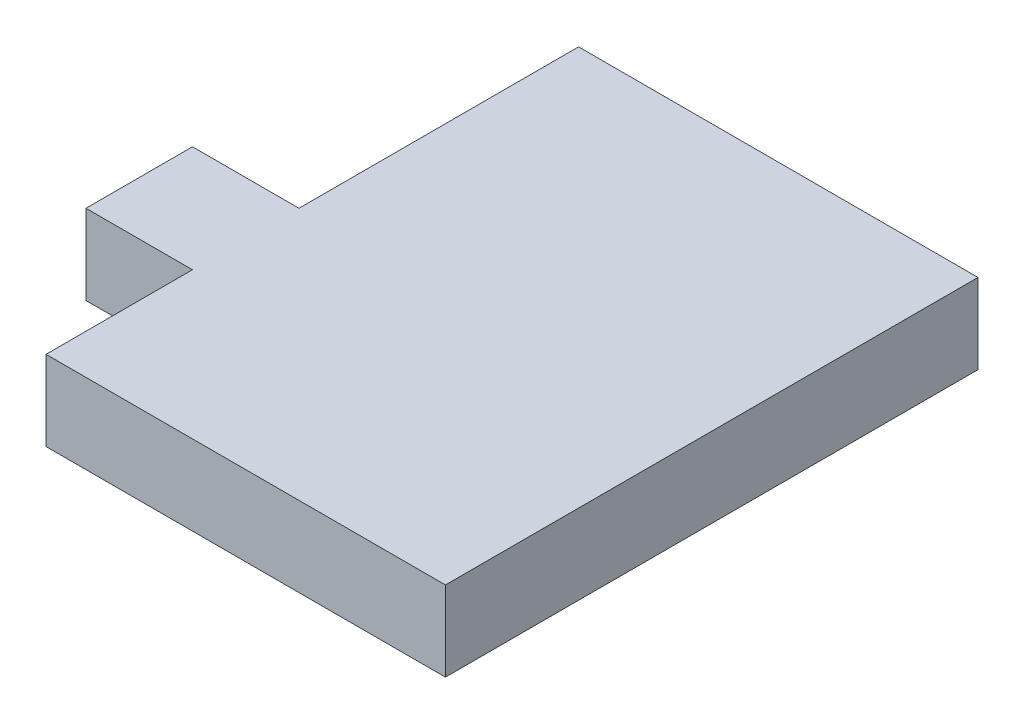
ISO-10303-21;
HEADER;
FILE_DESCRIPTION(('STEP AP214'),'2;1');
FILE_NAME('part.step','',(''),(''),'','','');
FILE_SCHEMA(('AUTOMOTIVE_DESIGN { 1 0 10303 214 1 1 1 1 }'));
ENDSEC;
DATA;
#1=APPLICATION_CONTEXT('core data for automotive mechanical design processes');
#2=APPLICATION_PROTOCOL_DEFINITION('international standard','automotive_design',2000,#1);
#3=PRODUCT_CONTEXT('',#1,'mechanical');
#4=PRODUCT('Part','Part','',(#3));
#5=PRODUCT_RELATED_PRODUCT_CATEGORY('part','',(#4));
#6=PRODUCT_DEFINITION_FORMATION('','',#4);
#7=PRODUCT_DEFINITION_CONTEXT('part definition',#1,'design');
#8=PRODUCT_DEFINITION('design','',#6,#7);
#9=PRODUCT_DEFINITION_SHAPE('','',#8);
#10=(LENGTH_UNIT() NAMED_UNIT(*) SI_UNIT(.MILLI.,.METRE.));
#11=(NAMED_UNIT(*) PLANE_ANGLE_UNIT() SI_UNIT($,.RADIAN.));
#12=(NAMED_UNIT(*) SI_UNIT($,.STERADIAN.) SOLID_ANGLE_UNIT());
#13=UNCERTAINTY_MEASURE_WITH_UNIT(LENGTH_MEASURE(1.E-05),#10,'distance_accuracy_value','');
#14=(GEOMETRIC_REPRESENTATION_CONTEXT(3) GLOBAL_UNCERTAINTY_ASSIGNED_CONTEXT((#13)) GLOBAL_UNIT_ASSIGNED_CONTEXT((#10,
#11,#12)) REPRESENTATION_CONTEXT('',''));
#15=CARTESIAN_POINT('',(0.,0.,0.));
#16=DIRECTION('',(0.,0.,1.));
#17=DIRECTION('',(1.,0.,0.));
#18=AXIS2_PLACEMENT_3D('',#15,#16,#17);
#19=CARTESIAN_POINT('',(0.,0.3,-2.));
#20=DIRECTION('',(-1.,0.,0.));
#21=DIRECTION('',(0.,0.,1.));
#22=AXIS2_PLACEMENT_3D('',#19,#20,#21);
#23=PLANE('',#22);
#24=DIRECTION('',(0.,0.,-1.));
#25=VECTOR('',#24,1.);
#26=CARTESIAN_POINT('',(0.,0.,-2.));
#27=LINE('',#26,#25);
#28=CARTESIAN_POINT('',(0.,0.,0.));
#29=VERTEX_POINT('',#28);
#30=CARTESIAN_POINT('',(0.,0.,-2.));
#31=VERTEX_POINT('',#30);
#32=EDGE_CURVE('E136',#29,#31,#27,.T.);
#33=ORIENTED_EDGE('',*,*,#32,.T.);
#34=DIRECTION('',(0.,-1.,0.));
#35=VECTOR('',#34,1.);
#36=CARTESIAN_POINT('',(0.,0.3,-2.));
#37=LINE('',#36,#35);
#38=CARTESIAN_POINT('',(0.,0.3,-2.));
#39=VERTEX_POINT('',#38);
#40=EDGE_CURVE('E11',#39,#31,#37,.T.);
#41=ORIENTED_EDGE('',*,*,#40,.F.);
#42=DIRECTION('',(0.,0.,-1.));
#43=VECTOR('',#42,1.);
#44=CARTESIAN_POINT('',(0.,0.3,-2.));
#45=LINE('',#44,#43);
#46=CARTESIAN_POINT('',(0.,0.3,0.));
#47=VERTEX_POINT('',#46);
#48=EDGE_CURVE('E152',#47,#39,#45,.T.);
#49=ORIENTED_EDGE('',*,*,#48,.F.);
#50=DIRECTION('',(0.,-1.,0.));
#51=VECTOR('',#50,1.);
#52=CARTESIAN_POINT('',(0.,0.3,0.));
#53=LINE('',#52,#51);
#54=EDGE_CURVE('E132',#47,#29,#53,.T.);
#55=ORIENTED_EDGE('',*,*,#54,.T.);
#56=EDGE_LOOP('',(#33,#41,#49,#55));
#57=FACE_BOUND('',#56,.T.);
#58=ADVANCED_FACE('F37',(#57),#23,.F.);
#59=CARTESIAN_POINT('',(0.,0.3,-2.));
#60=DIRECTION('',(0.,0.,1.));
#61=DIRECTION('',(1.,0.,0.));
#62=AXIS2_PLACEMENT_3D('',#59,#60,#61);
#63=PLANE('',#62);
#64=DIRECTION('',(-1.,0.,0.));
#65=VECTOR('',#64,1.);
#66=CARTESIAN_POINT('',(0.,0.,-2.));
#67=LINE('',#66,#65);
#68=CARTESIAN_POINT('',(-1.5,0.,-2.));
#69=VERTEX_POINT('',#68);
#70=EDGE_CURVE('E140',#31,#69,#67,.T.);
#71=ORIENTED_EDGE('',*,*,#70,.T.);
#72=DIRECTION('',(0.,-1.,0.));
#73=VECTOR('',#72,1.);
#74=CARTESIAN_POINT('',(-1.5,0.3,-2.));
#75=LINE('',#74,#73);
#76=CARTESIAN_POINT('',(-1.5,0.3,-2.));
#77=VERTEX_POINT('',#76);
#78=EDGE_CURVE('E46',#77,#69,#75,.T.);
#79=ORIENTED_EDGE('',*,*,#78,.F.);
#80=DIRECTION('',(-1.,0.,0.));
#81=VECTOR('',#80,1.);
#82=CARTESIAN_POINT('',(0.,0.3,-2.));
#83=LINE('',#82,#81);
#84=EDGE_CURVE('E99',#39,#77,#83,.T.);
#85=ORIENTED_EDGE('',*,*,#84,.F.);
#86=ORIENTED_EDGE('',*,*,#40,.T.);
#87=EDGE_LOOP('',(#71,#79,#85,#86));
#88=FACE_BOUND('',#87,.T.);
#89=ADVANCED_FACE('F188',(#88),#63,.F.);
#90=CARTESIAN_POINT('',(-1.5,0.3,-2.));
#91=DIRECTION('',(1.,0.,0.));
#92=DIRECTION('',(0.,0.,-1.));
#93=AXIS2_PLACEMENT_3D('',#90,#91,#92);
#94=PLANE('',#93);
#95=DIRECTION('',(0.,0.,1.));
#96=VECTOR('',#95,1.);
#97=CARTESIAN_POINT('',(-1.5,0.,-2.));
#98=LINE('',#97,#96);
#99=CARTESIAN_POINT('',(-1.5,0.,-0.949999999999992));
#100=VERTEX_POINT('',#99);
#101=EDGE_CURVE('E143',#69,#100,#98,.T.);
#102=ORIENTED_EDGE('',*,*,#101,.T.);
#103=DIRECTION('',(0.,-1.,0.));
#104=VECTOR('',#103,1.);
#105=CARTESIAN_POINT('',(-1.5,0.3,-0.949999999999992));
#106=LINE('',#105,#104);
#107=CARTESIAN_POINT('',(-1.5,0.3,-0.949999999999992));
#108=VERTEX_POINT('',#107);
#109=EDGE_CURVE('E159',#108,#100,#106,.T.);
#110=ORIENTED_EDGE('',*,*,#109,.F.);
#111=DIRECTION('',(0.,0.,1.));
#112=VECTOR('',#111,1.);
#113=CARTESIAN_POINT('',(-1.5,0.3,-2.));
#114=LINE('',#113,#112);
#115=EDGE_CURVE('E167',#77,#108,#114,.T.);
#116=ORIENTED_EDGE('',*,*,#115,.F.);
#117=ORIENTED_EDGE('',*,*,#78,.T.);
#118=EDGE_LOOP('',(#102,#110,#116,#117));
#119=FACE_BOUND('',#118,.T.);
#120=ADVANCED_FACE('F165',(#119),#94,.F.);
#121=CARTESIAN_POINT('',(-1.5,0.3,-0.949999999999992));
#122=DIRECTION('',(0.,0.,1.));
#123=DIRECTION('',(1.,0.,0.));
#124=AXIS2_PLACEMENT_3D('',#121,#122,#123);
#125=PLANE('',#124);
#126=DIRECTION('',(-1.,0.,0.));
#127=VECTOR('',#126,1.);
#128=CARTESIAN_POINT('',(-1.5,0.,-0.949999999999992));
#129=LINE('',#128,#127);
#130=CARTESIAN_POINT('',(-1.9,0.,-0.949999999999992));
#131=VERTEX_POINT('',#130);
#132=EDGE_CURVE('E145',#100,#131,#129,.T.);
#133=ORIENTED_EDGE('',*,*,#132,.T.);
#134=DIRECTION('',(0.,-1.,0.));
#135=VECTOR('',#134,1.);
#136=CARTESIAN_POINT('',(-1.9,0.3,-0.949999999999992));
#137=LINE('',#136,#135);
#138=CARTESIAN_POINT('',(-1.9,0.3,-0.949999999999992));
#139=VERTEX_POINT('',#138);
#140=EDGE_CURVE('E156',#139,#131,#137,.T.);
#141=ORIENTED_EDGE('',*,*,#140,.F.);
#142=DIRECTION('',(-1.,0.,0.));
#143=VECTOR('',#142,1.);
#144=CARTESIAN_POINT('',(-1.5,0.3,-0.949999999999992));
#145=LINE('',#144,#143);
#146=EDGE_CURVE('E179',#108,#139,#145,.T.);
#147=ORIENTED_EDGE('',*,*,#146,.F.);
#148=ORIENTED_EDGE('',*,*,#109,.T.);
#149=EDGE_LOOP('',(#133,#141,#147,#148));
#150=FACE_BOUND('',#149,.T.);
#151=ADVANCED_FACE('F175',(#150),#125,.F.);
#152=CARTESIAN_POINT('',(-1.9,0.3,-0.949999999999992));
#153=DIRECTION('',(1.,0.,0.));
#154=DIRECTION('',(0.,0.,-1.));
#155=AXIS2_PLACEMENT_3D('',#152,#153,#154);
#156=PLANE('',#155);
#157=DIRECTION('',(0.,0.,1.));
#158=VECTOR('',#157,1.);
#159=CARTESIAN_POINT('',(-1.9,0.,-0.949999999999992));
#160=LINE('',#159,#158);
#161=CARTESIAN_POINT('',(-1.9,0.,-0.549999999999992));
#162=VERTEX_POINT('',#161);
#163=EDGE_CURVE('E147',#131,#162,#160,.T.);
#164=ORIENTED_EDGE('',*,*,#163,.T.);
#165=DIRECTION('',(0.,-1.,0.));
#166=VECTOR('',#165,1.);
#167=CARTESIAN_POINT('',(-1.9,0.3,-0.549999999999992));
#168=LINE('',#167,#166);
#169=CARTESIAN_POINT('',(-1.9,0.3,-0.549999999999992));
#170=VERTEX_POINT('',#169);
#171=EDGE_CURVE('E127',#170,#162,#168,.T.);
#172=ORIENTED_EDGE('',*,*,#171,.F.);
#173=DIRECTION('',(0.,0.,1.));
#174=VECTOR('',#173,1.);
#175=CARTESIAN_POINT('',(-1.9,0.3,-0.949999999999992));
#176=LINE('',#175,#174);
#177=EDGE_CURVE('E118',#139,#170,#176,.T.);
#178=ORIENTED_EDGE('',*,*,#177,.F.);
#179=ORIENTED_EDGE('',*,*,#140,.T.);
#180=EDGE_LOOP('',(#164,#172,#178,#179));
#181=FACE_BOUND('',#180,.T.);
#182=ADVANCED_FACE('F178',(#181),#156,.F.);
#183=CARTESIAN_POINT('',(-1.9,0.3,-0.549999999999992));
#184=DIRECTION('',(0.,0.,-1.));
#185=DIRECTION('',(-1.,0.,0.));
#186=AXIS2_PLACEMENT_3D('',#183,#184,#185);
#187=PLANE('',#186);
#188=DIRECTION('',(1.,0.,0.));
#189=VECTOR('',#188,1.);
#190=CARTESIAN_POINT('',(-1.9,0.,-0.549999999999992));
#191=LINE('',#190,#189);
#192=CARTESIAN_POINT('',(-1.5,0.,-0.549999999999992));
#193=VERTEX_POINT('',#192);
#194=EDGE_CURVE('E126',#162,#193,#191,.T.);
#195=ORIENTED_EDGE('',*,*,#194,.T.);
#196=DIRECTION('',(0.,-1.,0.));
#197=VECTOR('',#196,1.);
#198=CARTESIAN_POINT('',(-1.5,0.3,-0.549999999999992));
#199=LINE('',#198,#197);
#200=CARTESIAN_POINT('',(-1.5,0.3,-0.549999999999992));
#201=VERTEX_POINT('',#200);
#202=EDGE_CURVE('E123',#201,#193,#199,.T.);
#203=ORIENTED_EDGE('',*,*,#202,.F.);
#204=DIRECTION('',(1.,0.,0.));
#205=VECTOR('',#204,1.);
#206=CARTESIAN_POINT('',(-1.9,0.3,-0.549999999999992));
#207=LINE('',#206,#205);
#208=EDGE_CURVE('E112',#170,#201,#207,.T.);
#209=ORIENTED_EDGE('',*,*,#208,.F.);
#210=ORIENTED_EDGE('',*,*,#171,.T.);
#211=EDGE_LOOP('',(#195,#203,#209,#210));
#212=FACE_BOUND('',#211,.T.);
#213=ADVANCED_FACE('F124',(#212),#187,.F.);
#214=CARTESIAN_POINT('',(-1.5,0.3,-0.549999999999992));
#215=DIRECTION('',(1.,0.,0.));
#216=DIRECTION('',(0.,0.,-1.));
#217=AXIS2_PLACEMENT_3D('',#214,#215,#216);
#218=PLANE('',#217);
#219=DIRECTION('',(0.,0.,1.));
#220=VECTOR('',#219,1.);
#221=CARTESIAN_POINT('',(-1.5,0.,-0.549999999999992));
#222=LINE('',#221,#220);
#223=CARTESIAN_POINT('',(-1.5,0.,0.));
#224=VERTEX_POINT('',#223);
#225=EDGE_CURVE('E84',#193,#224,#222,.T.);
#226=ORIENTED_EDGE('',*,*,#225,.T.);
#227=DIRECTION('',(0.,-1.,0.));
#228=VECTOR('',#227,1.);
#229=CARTESIAN_POINT('',(-1.5,0.3,0.));
#230=LINE('',#229,#228);
#231=CARTESIAN_POINT('',(-1.5,0.3,0.));
#232=VERTEX_POINT('',#231);
#233=EDGE_CURVE('E128',#232,#224,#230,.T.);
#234=ORIENTED_EDGE('',*,*,#233,.F.);
#235=DIRECTION('',(0.,0.,1.));
#236=VECTOR('',#235,1.);
#237=CARTESIAN_POINT('',(-1.5,0.3,-0.549999999999992));
#238=LINE('',#237,#236);
#239=EDGE_CURVE('E116',#201,#232,#238,.T.);
#240=ORIENTED_EDGE('',*,*,#239,.F.);
#241=ORIENTED_EDGE('',*,*,#202,.T.);
#242=EDGE_LOOP('',(#226,#234,#240,#241));
#243=FACE_BOUND('',#242,.T.);
#244=ADVANCED_FACE('F130',(#243),#218,.F.);
#245=CARTESIAN_POINT('',(-1.5,0.3,0.));
#246=DIRECTION('',(0.,0.,-1.));
#247=DIRECTION('',(-1.,0.,0.));
#248=AXIS2_PLACEMENT_3D('',#245,#246,#247);
#249=PLANE('',#248);
#250=DIRECTION('',(1.,0.,0.));
#251=VECTOR('',#250,1.);
#252=CARTESIAN_POINT('',(-1.5,0.,0.));
#253=LINE('',#252,#251);
#254=EDGE_CURVE('E90',#224,#29,#253,.T.);
#255=ORIENTED_EDGE('',*,*,#254,.T.);
#256=ORIENTED_EDGE('',*,*,#54,.F.);
#257=DIRECTION('',(1.,0.,0.));
#258=VECTOR('',#257,1.);
#259=CARTESIAN_POINT('',(-1.5,0.3,0.));
#260=LINE('',#259,#258);
#261=EDGE_CURVE('E54',#232,#47,#260,.T.);
#262=ORIENTED_EDGE('',*,*,#261,.F.);
#263=ORIENTED_EDGE('',*,*,#233,.T.);
#264=EDGE_LOOP('',(#255,#256,#262,#263));
#265=FACE_BOUND('',#264,.T.);
#266=ADVANCED_FACE('F204',(#265),#249,.F.);
#267=CARTESIAN_POINT('',(0.,0.3,0.));
#268=DIRECTION('',(0.,1.,0.));
#269=DIRECTION('',(0.,0.,1.));
#270=AXIS2_PLACEMENT_3D('',#267,#268,#269);
#271=PLANE('',#270);
#272=ORIENTED_EDGE('',*,*,#48,.T.);
#273=ORIENTED_EDGE('',*,*,#84,.T.);
#274=ORIENTED_EDGE('',*,*,#115,.T.);
#275=ORIENTED_EDGE('',*,*,#146,.T.);
#276=ORIENTED_EDGE('',*,*,#177,.T.);
#277=ORIENTED_EDGE('',*,*,#208,.T.);
#278=ORIENTED_EDGE('',*,*,#239,.T.);
#279=ORIENTED_EDGE('',*,*,#261,.T.);
#280=EDGE_LOOP('',(#272,#273,#274,#275,#276,#277,#278,#279));
#281=FACE_BOUND('',#280,.T.);
#282=ADVANCED_FACE('F114',(#281),#271,.T.);
#283=CARTESIAN_POINT('',(0.,0.,0.));
#284=DIRECTION('',(0.,1.,0.));
#285=DIRECTION('',(0.,0.,1.));
#286=AXIS2_PLACEMENT_3D('',#283,#284,#285);
#287=PLANE('',#286);
#288=ORIENTED_EDGE('',*,*,#32,.F.);
#289=ORIENTED_EDGE('',*,*,#254,.F.);
#290=ORIENTED_EDGE('',*,*,#225,.F.);
#291=ORIENTED_EDGE('',*,*,#194,.F.);
#292=ORIENTED_EDGE('',*,*,#163,.F.);
#293=ORIENTED_EDGE('',*,*,#132,.F.);
#294=ORIENTED_EDGE('',*,*,#101,.F.);
#295=ORIENTED_EDGE('',*,*,#70,.F.);
#296=EDGE_LOOP('',(#288,#289,#290,#291,#292,#293,#294,#295));
#297=FACE_BOUND('',#296,.T.);
#298=ADVANCED_FACE('F171',(#297),#287,.F.);
#299=CLOSED_SHELL('',(#58,#89,#120,#151,#182,#213,#244,#266,#282,#298));
#300=MANIFOLD_SOLID_BREP('B2',#299);
#301=ADVANCED_BREP_SHAPE_REPRESENTATION('',(#18,#300),#14);
#302=SHAPE_DEFINITION_REPRESENTATION(#9,#301);
ENDSEC;
END-ISO-10303-21;
